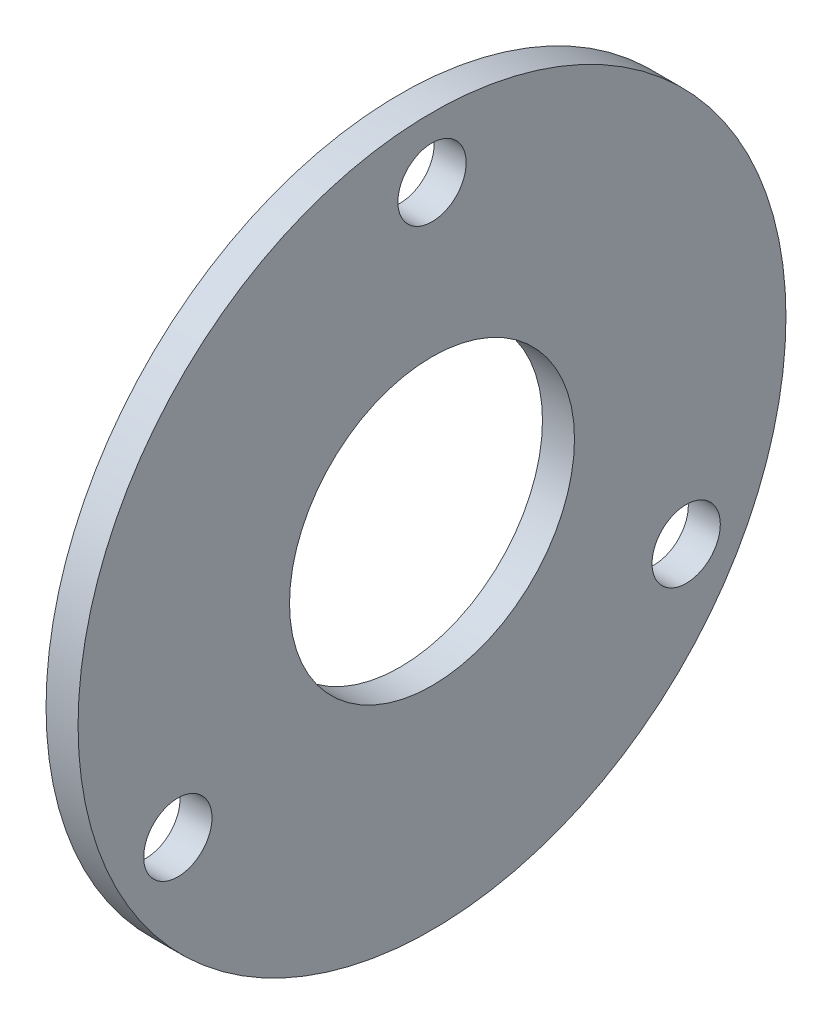
ISO-10303-21;
HEADER;
FILE_DESCRIPTION(('STEP AP214'),'2;1');
FILE_NAME('part.step','',(''),(''),'','','');
FILE_SCHEMA(('AUTOMOTIVE_DESIGN { 1 0 10303 214 1 1 1 1 }'));
ENDSEC;
DATA;
#1=APPLICATION_CONTEXT('core data for automotive mechanical design processes');
#2=APPLICATION_PROTOCOL_DEFINITION('international standard','automotive_design',2000,#1);
#3=PRODUCT_CONTEXT('',#1,'mechanical');
#4=PRODUCT('Part','Part','',(#3));
#5=PRODUCT_RELATED_PRODUCT_CATEGORY('part','',(#4));
#6=PRODUCT_DEFINITION_FORMATION('','',#4);
#7=PRODUCT_DEFINITION_CONTEXT('part definition',#1,'design');
#8=PRODUCT_DEFINITION('design','',#6,#7);
#9=PRODUCT_DEFINITION_SHAPE('','',#8);
#10=(LENGTH_UNIT() NAMED_UNIT(*) SI_UNIT(.MILLI.,.METRE.));
#11=(NAMED_UNIT(*) PLANE_ANGLE_UNIT() SI_UNIT($,.RADIAN.));
#12=(NAMED_UNIT(*) SI_UNIT($,.STERADIAN.) SOLID_ANGLE_UNIT());
#13=UNCERTAINTY_MEASURE_WITH_UNIT(LENGTH_MEASURE(1.E-05),#10,'distance_accuracy_value','');
#14=(GEOMETRIC_REPRESENTATION_CONTEXT(3) GLOBAL_UNCERTAINTY_ASSIGNED_CONTEXT((#13)) GLOBAL_UNIT_ASSIGNED_CONTEXT((#10,
#11,#12)) REPRESENTATION_CONTEXT('',''));
#15=CARTESIAN_POINT('',(0.,0.,0.));
#16=DIRECTION('',(0.,0.,1.));
#17=DIRECTION('',(1.,0.,0.));
#18=AXIS2_PLACEMENT_3D('',#15,#16,#17);
#19=CARTESIAN_POINT('',(-31.5025201617138,0.,0.));
#20=DIRECTION('',(1.,0.,0.));
#21=DIRECTION('',(0.,0.,-1.));
#22=AXIS2_PLACEMENT_3D('',#19,#20,#21);
#23=PLANE('',#22);
#24=CARTESIAN_POINT('',(-31.5025201617138,27.5,0.));
#25=DIRECTION('',(1.,0.,0.));
#26=DIRECTION('',(0.,0.,-1.));
#27=AXIS2_PLACEMENT_3D('',#24,#25,#26);
#28=CIRCLE('',#27,3.2);
#29=CARTESIAN_POINT('',(-31.5025201617138,27.5,-3.2));
#30=VERTEX_POINT('',#29);
#31=EDGE_CURVE('E67',#30,#30,#28,.T.);
#32=ORIENTED_EDGE('',*,*,#31,.T.);
#33=EDGE_LOOP('',(#32));
#34=FACE_BOUND('',#33,.T.);
#35=CARTESIAN_POINT('',(-31.5025201617138,-13.749999999999,-23.8156986040738));
#36=DIRECTION('',(1.,0.,0.));
#37=DIRECTION('',(0.,0.,-1.));
#38=AXIS2_PLACEMENT_3D('',#35,#36,#37);
#39=CIRCLE('',#38,3.20000000000152);
#40=CARTESIAN_POINT('',(-31.5025201617138,-13.749999999999,-27.0156986040754));
#41=VERTEX_POINT('',#40);
#42=EDGE_CURVE('E80',#41,#41,#39,.T.);
#43=ORIENTED_EDGE('',*,*,#42,.T.);
#44=EDGE_LOOP('',(#43));
#45=FACE_BOUND('',#44,.T.);
#46=CARTESIAN_POINT('',(-31.5025201617138,-13.750000000001,23.8156986040703));
#47=DIRECTION('',(1.,0.,0.));
#48=DIRECTION('',(0.,0.,-1.));
#49=AXIS2_PLACEMENT_3D('',#46,#47,#48);
#50=CIRCLE('',#49,3.20000000000222);
#51=CARTESIAN_POINT('',(-31.5025201617138,-13.750000000001,20.6156986040681));
#52=VERTEX_POINT('',#51);
#53=EDGE_CURVE('E72',#52,#52,#50,.T.);
#54=ORIENTED_EDGE('',*,*,#53,.T.);
#55=EDGE_LOOP('',(#54));
#56=FACE_BOUND('',#55,.T.);
#57=CARTESIAN_POINT('',(-31.5025201617138,0.,0.));
#58=DIRECTION('',(1.,0.,0.));
#59=DIRECTION('',(0.,0.,-1.));
#60=AXIS2_PLACEMENT_3D('',#57,#58,#59);
#61=CIRCLE('',#60,33.166);
#62=CARTESIAN_POINT('',(-31.5025201617138,0.,-33.166));
#63=VERTEX_POINT('',#62);
#64=EDGE_CURVE('E61',#63,#63,#61,.T.);
#65=ORIENTED_EDGE('',*,*,#64,.F.);
#66=EDGE_LOOP('',(#65));
#67=FACE_BOUND('',#66,.T.);
#68=CARTESIAN_POINT('',(-31.5025201617138,0.,0.));
#69=DIRECTION('',(1.,0.,0.));
#70=DIRECTION('',(0.,0.,-1.));
#71=AXIS2_PLACEMENT_3D('',#68,#69,#70);
#72=CIRCLE('',#71,13.351);
#73=CARTESIAN_POINT('',(-31.5025201617138,0.,-13.351));
#74=VERTEX_POINT('',#73);
#75=EDGE_CURVE('E10',#74,#74,#72,.T.);
#76=ORIENTED_EDGE('',*,*,#75,.T.);
#77=EDGE_LOOP('',(#76));
#78=FACE_BOUND('',#77,.T.);
#79=ADVANCED_FACE('F44',(#34,#45,#56,#67,#78),#23,.F.);
#80=CARTESIAN_POINT('',(0.,0.,0.));
#81=DIRECTION('',(1.,0.,0.));
#82=DIRECTION('',(0.,0.,-1.));
#83=AXIS2_PLACEMENT_3D('',#80,#81,#82);
#84=CYLINDRICAL_SURFACE('',#83,13.351);
#85=CARTESIAN_POINT('',(-28.5025201617138,0.,0.));
#86=DIRECTION('',(1.,0.,0.));
#87=DIRECTION('',(0.,0.,-1.));
#88=AXIS2_PLACEMENT_3D('',#85,#86,#87);
#89=CIRCLE('',#88,13.351);
#90=CARTESIAN_POINT('',(-28.5025201617138,0.,-13.351));
#91=VERTEX_POINT('',#90);
#92=EDGE_CURVE('E51',#91,#91,#89,.T.);
#93=ORIENTED_EDGE('',*,*,#92,.T.);
#94=EDGE_LOOP('',(#93));
#95=FACE_BOUND('',#94,.T.);
#96=ORIENTED_EDGE('',*,*,#75,.F.);
#97=EDGE_LOOP('',(#96));
#98=FACE_BOUND('',#97,.T.);
#99=ADVANCED_FACE('F105',(#95,#98),#84,.F.);
#100=CARTESIAN_POINT('',(-28.5025201617138,0.,0.));
#101=DIRECTION('',(1.,0.,0.));
#102=DIRECTION('',(0.,0.,-1.));
#103=AXIS2_PLACEMENT_3D('',#100,#101,#102);
#104=PLANE('',#103);
#105=CARTESIAN_POINT('',(-28.5025201617138,27.5,0.));
#106=DIRECTION('',(1.,0.,0.));
#107=DIRECTION('',(0.,0.,-1.));
#108=AXIS2_PLACEMENT_3D('',#105,#106,#107);
#109=CIRCLE('',#108,3.2);
#110=CARTESIAN_POINT('',(-28.5025201617138,27.5,-3.2));
#111=VERTEX_POINT('',#110);
#112=EDGE_CURVE('E84',#111,#111,#109,.T.);
#113=ORIENTED_EDGE('',*,*,#112,.F.);
#114=EDGE_LOOP('',(#113));
#115=FACE_BOUND('',#114,.T.);
#116=CARTESIAN_POINT('',(-28.5025201617138,-13.749999999999,-23.8156986040738));
#117=DIRECTION('',(1.,0.,0.));
#118=DIRECTION('',(0.,0.,-1.));
#119=AXIS2_PLACEMENT_3D('',#116,#117,#118);
#120=CIRCLE('',#119,3.20000000000152);
#121=CARTESIAN_POINT('',(-28.5025201617138,-13.749999999999,-27.0156986040754));
#122=VERTEX_POINT('',#121);
#123=EDGE_CURVE('E76',#122,#122,#120,.T.);
#124=ORIENTED_EDGE('',*,*,#123,.F.);
#125=EDGE_LOOP('',(#124));
#126=FACE_BOUND('',#125,.T.);
#127=CARTESIAN_POINT('',(-28.5025201617138,-13.750000000001,23.8156986040703));
#128=DIRECTION('',(1.,0.,0.));
#129=DIRECTION('',(0.,0.,-1.));
#130=AXIS2_PLACEMENT_3D('',#127,#128,#129);
#131=CIRCLE('',#130,3.20000000000222);
#132=CARTESIAN_POINT('',(-28.5025201617138,-13.750000000001,20.6156986040681));
#133=VERTEX_POINT('',#132);
#134=EDGE_CURVE('E68',#133,#133,#131,.T.);
#135=ORIENTED_EDGE('',*,*,#134,.F.);
#136=EDGE_LOOP('',(#135));
#137=FACE_BOUND('',#136,.T.);
#138=CARTESIAN_POINT('',(-28.5025201617138,0.,0.));
#139=DIRECTION('',(1.,0.,0.));
#140=DIRECTION('',(0.,0.,-1.));
#141=AXIS2_PLACEMENT_3D('',#138,#139,#140);
#142=CIRCLE('',#141,33.166);
#143=CARTESIAN_POINT('',(-28.5025201617138,0.,-33.166));
#144=VERTEX_POINT('',#143);
#145=EDGE_CURVE('E56',#144,#144,#142,.T.);
#146=ORIENTED_EDGE('',*,*,#145,.T.);
#147=EDGE_LOOP('',(#146));
#148=FACE_BOUND('',#147,.T.);
#149=ORIENTED_EDGE('',*,*,#92,.F.);
#150=EDGE_LOOP('',(#149));
#151=FACE_BOUND('',#150,.T.);
#152=ADVANCED_FACE('F101',(#115,#126,#137,#148,#151),#104,.T.);
#153=CARTESIAN_POINT('',(0.,0.,0.));
#154=DIRECTION('',(1.,0.,0.));
#155=DIRECTION('',(0.,0.,-1.));
#156=AXIS2_PLACEMENT_3D('',#153,#154,#155);
#157=CYLINDRICAL_SURFACE('',#156,33.166);
#158=ORIENTED_EDGE('',*,*,#145,.F.);
#159=EDGE_LOOP('',(#158));
#160=FACE_BOUND('',#159,.T.);
#161=ORIENTED_EDGE('',*,*,#64,.T.);
#162=EDGE_LOOP('',(#161));
#163=FACE_BOUND('',#162,.T.);
#164=ADVANCED_FACE('F104',(#160,#163),#157,.T.);
#165=CARTESIAN_POINT('',(-31.5025201617138,-13.750000000001,23.8156986040703));
#166=DIRECTION('',(1.,0.,0.));
#167=DIRECTION('',(0.,0.,-1.));
#168=AXIS2_PLACEMENT_3D('',#165,#166,#167);
#169=CYLINDRICAL_SURFACE('',#168,3.20000000000222);
#170=CARTESIAN_POINT('',(-31.5025201617138,-13.750000000001,20.6156986040681));
#171=CARTESIAN_POINT('',(-31.4712701617138,-13.750000000001,20.6156986040681));
#172=CARTESIAN_POINT('',(-31.4400201617138,-13.750000000001,20.6156986040681));
#173=CARTESIAN_POINT('',(-31.3775201617138,-13.750000000001,20.6156986040681));
#174=CARTESIAN_POINT('',(-31.3462701617138,-13.750000000001,20.6156986040681));
#175=CARTESIAN_POINT('',(-31.2837701617138,-13.750000000001,20.6156986040681));
#176=CARTESIAN_POINT('',(-31.2525201617138,-13.750000000001,20.6156986040681));
#177=CARTESIAN_POINT('',(-31.1900201617138,-13.750000000001,20.6156986040681));
#178=CARTESIAN_POINT('',(-31.1587701617138,-13.750000000001,20.6156986040681));
#179=CARTESIAN_POINT('',(-31.0962701617138,-13.750000000001,20.6156986040681));
#180=CARTESIAN_POINT('',(-31.0650201617138,-13.750000000001,20.6156986040681));
#181=CARTESIAN_POINT('',(-31.0025201617138,-13.750000000001,20.6156986040681));
#182=CARTESIAN_POINT('',(-30.9712701617138,-13.750000000001,20.6156986040681));
#183=CARTESIAN_POINT('',(-30.9087701617138,-13.750000000001,20.6156986040681));
#184=CARTESIAN_POINT('',(-30.8775201617138,-13.750000000001,20.6156986040681));
#185=CARTESIAN_POINT('',(-30.8150201617138,-13.750000000001,20.6156986040681));
#186=CARTESIAN_POINT('',(-30.7837701617138,-13.750000000001,20.6156986040681));
#187=CARTESIAN_POINT('',(-30.7212701617138,-13.750000000001,20.6156986040681));
#188=CARTESIAN_POINT('',(-30.6900201617138,-13.750000000001,20.6156986040681));
#189=CARTESIAN_POINT('',(-30.6275201617138,-13.750000000001,20.6156986040681));
#190=CARTESIAN_POINT('',(-30.5962701617138,-13.750000000001,20.6156986040681));
#191=CARTESIAN_POINT('',(-30.5337701617138,-13.750000000001,20.6156986040681));
#192=CARTESIAN_POINT('',(-30.5025201617138,-13.750000000001,20.6156986040681));
#193=CARTESIAN_POINT('',(-30.4400201617138,-13.750000000001,20.6156986040681));
#194=CARTESIAN_POINT('',(-30.4087701617138,-13.750000000001,20.6156986040681));
#195=CARTESIAN_POINT('',(-30.3462701617138,-13.750000000001,20.6156986040681));
#196=CARTESIAN_POINT('',(-30.3150201617138,-13.750000000001,20.6156986040681));
#197=CARTESIAN_POINT('',(-30.2525201617138,-13.750000000001,20.6156986040681));
#198=CARTESIAN_POINT('',(-30.2212701617138,-13.750000000001,20.6156986040681));
#199=CARTESIAN_POINT('',(-30.1587701617138,-13.750000000001,20.6156986040681));
#200=CARTESIAN_POINT('',(-30.1275201617138,-13.750000000001,20.6156986040681));
#201=CARTESIAN_POINT('',(-30.0650201617138,-13.750000000001,20.6156986040681));
#202=CARTESIAN_POINT('',(-30.0337701617138,-13.750000000001,20.6156986040681));
#203=CARTESIAN_POINT('',(-29.9712701617138,-13.750000000001,20.6156986040681));
#204=CARTESIAN_POINT('',(-29.9400201617138,-13.750000000001,20.6156986040681));
#205=CARTESIAN_POINT('',(-29.8775201617138,-13.750000000001,20.6156986040681));
#206=CARTESIAN_POINT('',(-29.8462701617138,-13.750000000001,20.6156986040681));
#207=CARTESIAN_POINT('',(-29.7837701617138,-13.750000000001,20.6156986040681));
#208=CARTESIAN_POINT('',(-29.7525201617138,-13.750000000001,20.6156986040681));
#209=CARTESIAN_POINT('',(-29.6900201617138,-13.750000000001,20.6156986040681));
#210=CARTESIAN_POINT('',(-29.6587701617138,-13.750000000001,20.6156986040681));
#211=CARTESIAN_POINT('',(-29.5962701617138,-13.750000000001,20.6156986040681));
#212=CARTESIAN_POINT('',(-29.5650201617138,-13.750000000001,20.6156986040681));
#213=CARTESIAN_POINT('',(-29.5025201617138,-13.750000000001,20.6156986040681));
#214=CARTESIAN_POINT('',(-29.4712701617138,-13.750000000001,20.6156986040681));
#215=CARTESIAN_POINT('',(-29.4087701617138,-13.750000000001,20.6156986040681));
#216=CARTESIAN_POINT('',(-29.3775201617138,-13.750000000001,20.6156986040681));
#217=CARTESIAN_POINT('',(-29.3150201617138,-13.750000000001,20.6156986040681));
#218=CARTESIAN_POINT('',(-29.2837701617138,-13.750000000001,20.6156986040681));
#219=CARTESIAN_POINT('',(-29.2212701617138,-13.750000000001,20.6156986040681));
#220=CARTESIAN_POINT('',(-29.1900201617138,-13.750000000001,20.6156986040681));
#221=CARTESIAN_POINT('',(-29.1275201617138,-13.750000000001,20.6156986040681));
#222=CARTESIAN_POINT('',(-29.0962701617138,-13.750000000001,20.6156986040681));
#223=CARTESIAN_POINT('',(-29.0337701617138,-13.750000000001,20.6156986040681));
#224=CARTESIAN_POINT('',(-29.0025201617138,-13.750000000001,20.6156986040681));
#225=CARTESIAN_POINT('',(-28.9400201617138,-13.750000000001,20.6156986040681));
#226=CARTESIAN_POINT('',(-28.9087701617138,-13.750000000001,20.6156986040681));
#227=CARTESIAN_POINT('',(-28.8462701617138,-13.750000000001,20.6156986040681));
#228=CARTESIAN_POINT('',(-28.8150201617138,-13.750000000001,20.6156986040681));
#229=CARTESIAN_POINT('',(-28.7525201617138,-13.750000000001,20.6156986040681));
#230=CARTESIAN_POINT('',(-28.7212701617138,-13.750000000001,20.6156986040681));
#231=CARTESIAN_POINT('',(-28.6587701617138,-13.750000000001,20.6156986040681));
#232=CARTESIAN_POINT('',(-28.6275201617138,-13.750000000001,20.6156986040681));
#233=CARTESIAN_POINT('',(-28.5650201617138,-13.750000000001,20.6156986040681));
#234=CARTESIAN_POINT('',(-28.5337701617138,-13.750000000001,20.6156986040681));
#235=CARTESIAN_POINT('',(-28.5025201617138,-13.750000000001,20.6156986040681));
#236=B_SPLINE_CURVE_WITH_KNOTS('',3,(#170,#171,#172,#173,#174,#175,#176,#177,#178,#179,#180,
#181,#182,#183,#184,#185,#186,#187,#188,#189,#190,#191,#192,#193,#194,#195,#196,#197,#198,#199,
#200,#201,#202,#203,#204,#205,#206,#207,#208,#209,#210,#211,#212,#213,#214,#215,#216,#217,#218,
#219,#220,#221,#222,#223,#224,#225,#226,#227,#228,#229,#230,#231,#232,#233,#234,#235),
.UNSPECIFIED.,.F.,.F.,(4,2,2,2,2,2,2,2,2,2,2,2,2,2,2,2,2,2,2,2,2,2,2,2,2,2,2,2,2,2,2,2,4),(0.,
0.0937500000000036,0.187500000000007,0.281250000000004,0.375000000000004,0.468750000000004,
0.562500000000004,0.656250000000004,0.750000000000004,0.843750000000004,0.937500000000008,
1.03125000000001,1.12500000000001,1.21875000000001,1.31250000000001,1.40625000000001,
1.50000000000001,1.59375000000001,1.68750000000001,1.78125000000001,1.87500000000001,
1.96875000000001,2.06250000000001,2.15625000000001,2.25000000000001,2.34375000000001,
2.43750000000001,2.53125000000001,2.62500000000001,2.71875000000001,2.81250000000001,
2.90625000000001,3.00000000000001),.UNSPECIFIED.);
#237=EDGE_CURVE('BSEAM116',#52,#133,#236,.T.);
#238=ORIENTED_EDGE('',*,*,#53,.F.);
#239=ORIENTED_EDGE('',*,*,#134,.T.);
#240=ORIENTED_EDGE('',*,*,#237,.T.);
#241=ORIENTED_EDGE('',*,*,#237,.F.);
#242=EDGE_LOOP('',(#238,#240,#239,#241));
#243=FACE_BOUND('',#242,.T.);
#244=ADVANCED_FACE('F116',(#243),#169,.F.);
#245=CARTESIAN_POINT('',(-31.5025201617138,-13.749999999999,-23.8156986040738));
#246=DIRECTION('',(1.,0.,0.));
#247=DIRECTION('',(0.,0.,-1.));
#248=AXIS2_PLACEMENT_3D('',#245,#246,#247);
#249=CYLINDRICAL_SURFACE('',#248,3.20000000000152);
#250=CARTESIAN_POINT('',(-31.5025201617138,-13.749999999999,-27.0156986040754));
#251=CARTESIAN_POINT('',(-31.4712701617138,-13.749999999999,-27.0156986040754));
#252=CARTESIAN_POINT('',(-31.4400201617138,-13.749999999999,-27.0156986040754));
#253=CARTESIAN_POINT('',(-31.3775201617138,-13.749999999999,-27.0156986040754));
#254=CARTESIAN_POINT('',(-31.3462701617138,-13.749999999999,-27.0156986040754));
#255=CARTESIAN_POINT('',(-31.2837701617138,-13.749999999999,-27.0156986040754));
#256=CARTESIAN_POINT('',(-31.2525201617138,-13.749999999999,-27.0156986040754));
#257=CARTESIAN_POINT('',(-31.1900201617138,-13.749999999999,-27.0156986040754));
#258=CARTESIAN_POINT('',(-31.1587701617138,-13.749999999999,-27.0156986040754));
#259=CARTESIAN_POINT('',(-31.0962701617138,-13.749999999999,-27.0156986040754));
#260=CARTESIAN_POINT('',(-31.0650201617138,-13.749999999999,-27.0156986040754));
#261=CARTESIAN_POINT('',(-31.0025201617138,-13.749999999999,-27.0156986040754));
#262=CARTESIAN_POINT('',(-30.9712701617138,-13.749999999999,-27.0156986040754));
#263=CARTESIAN_POINT('',(-30.9087701617138,-13.749999999999,-27.0156986040754));
#264=CARTESIAN_POINT('',(-30.8775201617138,-13.749999999999,-27.0156986040754));
#265=CARTESIAN_POINT('',(-30.8150201617138,-13.749999999999,-27.0156986040754));
#266=CARTESIAN_POINT('',(-30.7837701617138,-13.749999999999,-27.0156986040754));
#267=CARTESIAN_POINT('',(-30.7212701617138,-13.749999999999,-27.0156986040754));
#268=CARTESIAN_POINT('',(-30.6900201617138,-13.749999999999,-27.0156986040754));
#269=CARTESIAN_POINT('',(-30.6275201617138,-13.749999999999,-27.0156986040754));
#270=CARTESIAN_POINT('',(-30.5962701617138,-13.749999999999,-27.0156986040754));
#271=CARTESIAN_POINT('',(-30.5337701617138,-13.749999999999,-27.0156986040754));
#272=CARTESIAN_POINT('',(-30.5025201617138,-13.749999999999,-27.0156986040754));
#273=CARTESIAN_POINT('',(-30.4400201617138,-13.749999999999,-27.0156986040754));
#274=CARTESIAN_POINT('',(-30.4087701617138,-13.749999999999,-27.0156986040754));
#275=CARTESIAN_POINT('',(-30.3462701617138,-13.749999999999,-27.0156986040754));
#276=CARTESIAN_POINT('',(-30.3150201617138,-13.749999999999,-27.0156986040754));
#277=CARTESIAN_POINT('',(-30.2525201617138,-13.749999999999,-27.0156986040754));
#278=CARTESIAN_POINT('',(-30.2212701617138,-13.749999999999,-27.0156986040754));
#279=CARTESIAN_POINT('',(-30.1587701617138,-13.749999999999,-27.0156986040754));
#280=CARTESIAN_POINT('',(-30.1275201617138,-13.749999999999,-27.0156986040754));
#281=CARTESIAN_POINT('',(-30.0650201617138,-13.749999999999,-27.0156986040754));
#282=CARTESIAN_POINT('',(-30.0337701617138,-13.749999999999,-27.0156986040754));
#283=CARTESIAN_POINT('',(-29.9712701617138,-13.749999999999,-27.0156986040754));
#284=CARTESIAN_POINT('',(-29.9400201617138,-13.749999999999,-27.0156986040754));
#285=CARTESIAN_POINT('',(-29.8775201617138,-13.749999999999,-27.0156986040754));
#286=CARTESIAN_POINT('',(-29.8462701617138,-13.749999999999,-27.0156986040754));
#287=CARTESIAN_POINT('',(-29.7837701617138,-13.749999999999,-27.0156986040754));
#288=CARTESIAN_POINT('',(-29.7525201617138,-13.749999999999,-27.0156986040754));
#289=CARTESIAN_POINT('',(-29.6900201617138,-13.749999999999,-27.0156986040754));
#290=CARTESIAN_POINT('',(-29.6587701617138,-13.749999999999,-27.0156986040754));
#291=CARTESIAN_POINT('',(-29.5962701617138,-13.749999999999,-27.0156986040754));
#292=CARTESIAN_POINT('',(-29.5650201617138,-13.749999999999,-27.0156986040754));
#293=CARTESIAN_POINT('',(-29.5025201617138,-13.749999999999,-27.0156986040754));
#294=CARTESIAN_POINT('',(-29.4712701617138,-13.749999999999,-27.0156986040754));
#295=CARTESIAN_POINT('',(-29.4087701617138,-13.749999999999,-27.0156986040754));
#296=CARTESIAN_POINT('',(-29.3775201617138,-13.749999999999,-27.0156986040754));
#297=CARTESIAN_POINT('',(-29.3150201617138,-13.749999999999,-27.0156986040754));
#298=CARTESIAN_POINT('',(-29.2837701617138,-13.749999999999,-27.0156986040754));
#299=CARTESIAN_POINT('',(-29.2212701617138,-13.749999999999,-27.0156986040754));
#300=CARTESIAN_POINT('',(-29.1900201617138,-13.749999999999,-27.0156986040754));
#301=CARTESIAN_POINT('',(-29.1275201617138,-13.749999999999,-27.0156986040754));
#302=CARTESIAN_POINT('',(-29.0962701617138,-13.749999999999,-27.0156986040754));
#303=CARTESIAN_POINT('',(-29.0337701617138,-13.749999999999,-27.0156986040754));
#304=CARTESIAN_POINT('',(-29.0025201617138,-13.749999999999,-27.0156986040754));
#305=CARTESIAN_POINT('',(-28.9400201617138,-13.749999999999,-27.0156986040754));
#306=CARTESIAN_POINT('',(-28.9087701617138,-13.749999999999,-27.0156986040754));
#307=CARTESIAN_POINT('',(-28.8462701617138,-13.749999999999,-27.0156986040754));
#308=CARTESIAN_POINT('',(-28.8150201617138,-13.749999999999,-27.0156986040754));
#309=CARTESIAN_POINT('',(-28.7525201617138,-13.749999999999,-27.0156986040754));
#310=CARTESIAN_POINT('',(-28.7212701617138,-13.749999999999,-27.0156986040754));
#311=CARTESIAN_POINT('',(-28.6587701617138,-13.749999999999,-27.0156986040754));
#312=CARTESIAN_POINT('',(-28.6275201617138,-13.749999999999,-27.0156986040754));
#313=CARTESIAN_POINT('',(-28.5650201617138,-13.749999999999,-27.0156986040754));
#314=CARTESIAN_POINT('',(-28.5337701617138,-13.749999999999,-27.0156986040754));
#315=CARTESIAN_POINT('',(-28.5025201617138,-13.749999999999,-27.0156986040754));
#316=B_SPLINE_CURVE_WITH_KNOTS('',3,(#250,#251,#252,#253,#254,#255,#256,#257,#258,#259,#260,
#261,#262,#263,#264,#265,#266,#267,#268,#269,#270,#271,#272,#273,#274,#275,#276,#277,#278,#279,
#280,#281,#282,#283,#284,#285,#286,#287,#288,#289,#290,#291,#292,#293,#294,#295,#296,#297,#298,
#299,#300,#301,#302,#303,#304,#305,#306,#307,#308,#309,#310,#311,#312,#313,#314,#315),
.UNSPECIFIED.,.F.,.F.,(4,2,2,2,2,2,2,2,2,2,2,2,2,2,2,2,2,2,2,2,2,2,2,2,2,2,2,2,2,2,2,2,4),(0.,
0.0937500000000036,0.187500000000007,0.281250000000004,0.375000000000004,0.468750000000004,
0.562500000000004,0.656250000000004,0.750000000000004,0.843750000000004,0.937500000000008,
1.03125000000001,1.12500000000001,1.21875000000001,1.31250000000001,1.40625000000001,
1.50000000000001,1.59375000000001,1.68750000000001,1.78125000000001,1.87500000000001,
1.96875000000001,2.06250000000001,2.15625000000001,2.25000000000001,2.34375000000001,
2.43750000000001,2.53125000000001,2.62500000000001,2.71875000000001,2.81250000000001,
2.90625000000001,3.00000000000001),.UNSPECIFIED.);
#317=EDGE_CURVE('BSEAM97',#41,#122,#316,.T.);
#318=ORIENTED_EDGE('',*,*,#42,.F.);
#319=ORIENTED_EDGE('',*,*,#123,.T.);
#320=ORIENTED_EDGE('',*,*,#317,.T.);
#321=ORIENTED_EDGE('',*,*,#317,.F.);
#322=EDGE_LOOP('',(#318,#320,#319,#321));
#323=FACE_BOUND('',#322,.T.);
#324=ADVANCED_FACE('F97',(#323),#249,.F.);
#325=CARTESIAN_POINT('',(-31.5025201617138,27.5,0.));
#326=DIRECTION('',(1.,0.,0.));
#327=DIRECTION('',(0.,0.,-1.));
#328=AXIS2_PLACEMENT_3D('',#325,#326,#327);
#329=CYLINDRICAL_SURFACE('',#328,3.2);
#330=CARTESIAN_POINT('',(-31.5025201617138,27.5,-3.2));
#331=CARTESIAN_POINT('',(-31.4712701617138,27.5,-3.2));
#332=CARTESIAN_POINT('',(-31.4400201617138,27.5,-3.2));
#333=CARTESIAN_POINT('',(-31.3775201617138,27.5,-3.2));
#334=CARTESIAN_POINT('',(-31.3462701617138,27.5,-3.2));
#335=CARTESIAN_POINT('',(-31.2837701617138,27.5,-3.2));
#336=CARTESIAN_POINT('',(-31.2525201617138,27.5,-3.2));
#337=CARTESIAN_POINT('',(-31.1900201617138,27.5,-3.2));
#338=CARTESIAN_POINT('',(-31.1587701617138,27.5,-3.2));
#339=CARTESIAN_POINT('',(-31.0962701617138,27.5,-3.2));
#340=CARTESIAN_POINT('',(-31.0650201617138,27.5,-3.2));
#341=CARTESIAN_POINT('',(-31.0025201617138,27.5,-3.2));
#342=CARTESIAN_POINT('',(-30.9712701617138,27.5,-3.2));
#343=CARTESIAN_POINT('',(-30.9087701617138,27.5,-3.2));
#344=CARTESIAN_POINT('',(-30.8775201617138,27.5,-3.2));
#345=CARTESIAN_POINT('',(-30.8150201617138,27.5,-3.2));
#346=CARTESIAN_POINT('',(-30.7837701617138,27.5,-3.2));
#347=CARTESIAN_POINT('',(-30.7212701617138,27.5,-3.2));
#348=CARTESIAN_POINT('',(-30.6900201617138,27.5,-3.2));
#349=CARTESIAN_POINT('',(-30.6275201617138,27.5,-3.2));
#350=CARTESIAN_POINT('',(-30.5962701617138,27.5,-3.2));
#351=CARTESIAN_POINT('',(-30.5337701617138,27.5,-3.2));
#352=CARTESIAN_POINT('',(-30.5025201617138,27.5,-3.2));
#353=CARTESIAN_POINT('',(-30.4400201617138,27.5,-3.2));
#354=CARTESIAN_POINT('',(-30.4087701617138,27.5,-3.2));
#355=CARTESIAN_POINT('',(-30.3462701617138,27.5,-3.2));
#356=CARTESIAN_POINT('',(-30.3150201617138,27.5,-3.2));
#357=CARTESIAN_POINT('',(-30.2525201617138,27.5,-3.2));
#358=CARTESIAN_POINT('',(-30.2212701617138,27.5,-3.2));
#359=CARTESIAN_POINT('',(-30.1587701617138,27.5,-3.2));
#360=CARTESIAN_POINT('',(-30.1275201617138,27.5,-3.2));
#361=CARTESIAN_POINT('',(-30.0650201617138,27.5,-3.2));
#362=CARTESIAN_POINT('',(-30.0337701617138,27.5,-3.2));
#363=CARTESIAN_POINT('',(-29.9712701617138,27.5,-3.2));
#364=CARTESIAN_POINT('',(-29.9400201617138,27.5,-3.2));
#365=CARTESIAN_POINT('',(-29.8775201617138,27.5,-3.2));
#366=CARTESIAN_POINT('',(-29.8462701617138,27.5,-3.2));
#367=CARTESIAN_POINT('',(-29.7837701617138,27.5,-3.2));
#368=CARTESIAN_POINT('',(-29.7525201617138,27.5,-3.2));
#369=CARTESIAN_POINT('',(-29.6900201617138,27.5,-3.2));
#370=CARTESIAN_POINT('',(-29.6587701617138,27.5,-3.2));
#371=CARTESIAN_POINT('',(-29.5962701617138,27.5,-3.2));
#372=CARTESIAN_POINT('',(-29.5650201617138,27.5,-3.2));
#373=CARTESIAN_POINT('',(-29.5025201617138,27.5,-3.2));
#374=CARTESIAN_POINT('',(-29.4712701617138,27.5,-3.2));
#375=CARTESIAN_POINT('',(-29.4087701617138,27.5,-3.2));
#376=CARTESIAN_POINT('',(-29.3775201617138,27.5,-3.2));
#377=CARTESIAN_POINT('',(-29.3150201617138,27.5,-3.2));
#378=CARTESIAN_POINT('',(-29.2837701617138,27.5,-3.2));
#379=CARTESIAN_POINT('',(-29.2212701617138,27.5,-3.2));
#380=CARTESIAN_POINT('',(-29.1900201617138,27.5,-3.2));
#381=CARTESIAN_POINT('',(-29.1275201617138,27.5,-3.2));
#382=CARTESIAN_POINT('',(-29.0962701617138,27.5,-3.2));
#383=CARTESIAN_POINT('',(-29.0337701617138,27.5,-3.2));
#384=CARTESIAN_POINT('',(-29.0025201617138,27.5,-3.2));
#385=CARTESIAN_POINT('',(-28.9400201617138,27.5,-3.2));
#386=CARTESIAN_POINT('',(-28.9087701617138,27.5,-3.2));
#387=CARTESIAN_POINT('',(-28.8462701617138,27.5,-3.2));
#388=CARTESIAN_POINT('',(-28.8150201617138,27.5,-3.2));
#389=CARTESIAN_POINT('',(-28.7525201617138,27.5,-3.2));
#390=CARTESIAN_POINT('',(-28.7212701617138,27.5,-3.2));
#391=CARTESIAN_POINT('',(-28.6587701617138,27.5,-3.2));
#392=CARTESIAN_POINT('',(-28.6275201617138,27.5,-3.2));
#393=CARTESIAN_POINT('',(-28.5650201617138,27.5,-3.2));
#394=CARTESIAN_POINT('',(-28.5337701617138,27.5,-3.2));
#395=CARTESIAN_POINT('',(-28.5025201617138,27.5,-3.2));
#396=B_SPLINE_CURVE_WITH_KNOTS('',3,(#330,#331,#332,#333,#334,#335,#336,#337,#338,#339,#340,
#341,#342,#343,#344,#345,#346,#347,#348,#349,#350,#351,#352,#353,#354,#355,#356,#357,#358,#359,
#360,#361,#362,#363,#364,#365,#366,#367,#368,#369,#370,#371,#372,#373,#374,#375,#376,#377,#378,
#379,#380,#381,#382,#383,#384,#385,#386,#387,#388,#389,#390,#391,#392,#393,#394,#395),
.UNSPECIFIED.,.F.,.F.,(4,2,2,2,2,2,2,2,2,2,2,2,2,2,2,2,2,2,2,2,2,2,2,2,2,2,2,2,2,2,2,2,4),(0.,
0.0937500000000036,0.187500000000007,0.281250000000004,0.375000000000004,0.468750000000004,
0.562500000000004,0.656250000000004,0.750000000000004,0.843750000000004,0.937500000000008,
1.03125000000001,1.12500000000001,1.21875000000001,1.31250000000001,1.40625000000001,
1.50000000000001,1.59375000000001,1.68750000000001,1.78125000000001,1.87500000000001,
1.96875000000001,2.06250000000001,2.15625000000001,2.25000000000001,2.34375000000001,
2.43750000000001,2.53125000000001,2.62500000000001,2.71875000000001,2.81250000000001,
2.90625000000001,3.00000000000001),.UNSPECIFIED.);
#397=EDGE_CURVE('BSEAM94',#30,#111,#396,.T.);
#398=ORIENTED_EDGE('',*,*,#31,.F.);
#399=ORIENTED_EDGE('',*,*,#112,.T.);
#400=ORIENTED_EDGE('',*,*,#397,.T.);
#401=ORIENTED_EDGE('',*,*,#397,.F.);
#402=EDGE_LOOP('',(#398,#400,#399,#401));
#403=FACE_BOUND('',#402,.T.);
#404=ADVANCED_FACE('F94',(#403),#329,.F.);
#405=CLOSED_SHELL('',(#79,#99,#152,#164,#244,#324,#404));
#406=MANIFOLD_SOLID_BREP('B2',#405);
#407=ADVANCED_BREP_SHAPE_REPRESENTATION('',(#18,#406),#14);
#408=SHAPE_DEFINITION_REPRESENTATION(#9,#407);
ENDSEC;
END-ISO-10303-21;
